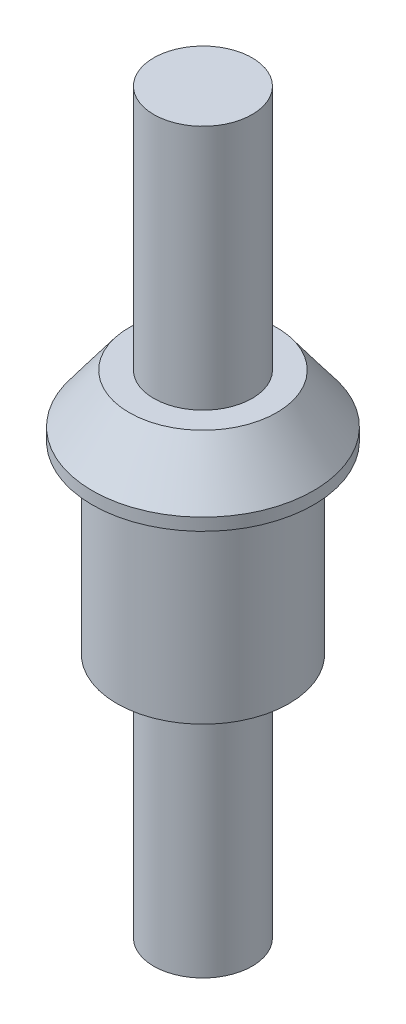
ISO-10303-21;
HEADER;
FILE_DESCRIPTION(('STEP AP214'),'2;1');
FILE_NAME('part.step','',(''),(''),'','','');
FILE_SCHEMA(('AUTOMOTIVE_DESIGN { 1 0 10303 214 1 1 1 1 }'));
ENDSEC;
DATA;
#1=APPLICATION_CONTEXT('core data for automotive mechanical design processes');
#2=APPLICATION_PROTOCOL_DEFINITION('international standard','automotive_design',2000,#1);
#3=PRODUCT_CONTEXT('',#1,'mechanical');
#4=PRODUCT('Part','Part','',(#3));
#5=PRODUCT_RELATED_PRODUCT_CATEGORY('part','',(#4));
#6=PRODUCT_DEFINITION_FORMATION('','',#4);
#7=PRODUCT_DEFINITION_CONTEXT('part definition',#1,'design');
#8=PRODUCT_DEFINITION('design','',#6,#7);
#9=PRODUCT_DEFINITION_SHAPE('','',#8);
#10=(LENGTH_UNIT() NAMED_UNIT(*) SI_UNIT(.MILLI.,.METRE.));
#11=(NAMED_UNIT(*) PLANE_ANGLE_UNIT() SI_UNIT($,.RADIAN.));
#12=(NAMED_UNIT(*) SI_UNIT($,.STERADIAN.) SOLID_ANGLE_UNIT());
#13=UNCERTAINTY_MEASURE_WITH_UNIT(LENGTH_MEASURE(1.E-05),#10,'distance_accuracy_value','');
#14=(GEOMETRIC_REPRESENTATION_CONTEXT(3) GLOBAL_UNCERTAINTY_ASSIGNED_CONTEXT((#13)) GLOBAL_UNIT_ASSIGNED_CONTEXT((#10,
#11,#12)) REPRESENTATION_CONTEXT('',''));
#15=CARTESIAN_POINT('',(0.,0.,0.));
#16=DIRECTION('',(0.,0.,1.));
#17=DIRECTION('',(1.,0.,0.));
#18=AXIS2_PLACEMENT_3D('',#15,#16,#17);
#19=CARTESIAN_POINT('',(0.,-9.44996568995171,0.));
#20=DIRECTION('',(0.,-1.,0.));
#21=DIRECTION('',(0.,0.,-1.));
#22=AXIS2_PLACEMENT_3D('',#19,#20,#21);
#23=PLANE('',#22);
#24=CARTESIAN_POINT('',(0.,-9.44996568995171,0.));
#25=DIRECTION('',(0.,1.,0.));
#26=DIRECTION('',(0.,0.,1.));
#27=AXIS2_PLACEMENT_3D('',#24,#25,#26);
#28=CIRCLE('',#27,0.400000000000005);
#29=CARTESIAN_POINT('',(0.,-9.44996568995171,0.400000000000005));
#30=VERTEX_POINT('',#29);
#31=EDGE_CURVE('E10',#30,#30,#28,.T.);
#32=ORIENTED_EDGE('',*,*,#31,.T.);
#33=EDGE_LOOP('',(#32));
#34=FACE_BOUND('',#33,.T.);
#35=ADVANCED_FACE('F30',(#34),#23,.F.);
#36=CARTESIAN_POINT('',(0.,28.0280897143989,0.));
#37=DIRECTION('',(0.,1.,0.));
#38=DIRECTION('',(0.,0.,1.));
#39=AXIS2_PLACEMENT_3D('',#36,#37,#38);
#40=CYLINDRICAL_SURFACE('',#39,0.400000000000005);
#41=ORIENTED_EDGE('',*,*,#31,.F.);
#42=EDGE_LOOP('',(#41));
#43=FACE_BOUND('',#42,.T.);
#44=CARTESIAN_POINT('',(0.,-11.4499656899517,0.));
#45=DIRECTION('',(0.,1.,0.));
#46=DIRECTION('',(0.,0.,1.));
#47=AXIS2_PLACEMENT_3D('',#44,#45,#46);
#48=CIRCLE('',#47,0.400000000000005);
#49=CARTESIAN_POINT('',(0.,-11.4499656899517,0.400000000000005));
#50=VERTEX_POINT('',#49);
#51=EDGE_CURVE('E36',#50,#50,#48,.T.);
#52=ORIENTED_EDGE('',*,*,#51,.T.);
#53=EDGE_LOOP('',(#52));
#54=FACE_BOUND('',#53,.T.);
#55=ADVANCED_FACE('F77',(#43,#54),#40,.T.);
#56=CARTESIAN_POINT('',(0.400000000000005,-11.4499656899517,0.));
#57=DIRECTION('',(0.,-1.,0.));
#58=DIRECTION('',(0.,0.,-1.));
#59=AXIS2_PLACEMENT_3D('',#56,#57,#58);
#60=PLANE('',#59);
#61=ORIENTED_EDGE('',*,*,#51,.F.);
#62=EDGE_LOOP('',(#61));
#63=FACE_BOUND('',#62,.T.);
#64=CARTESIAN_POINT('',(0.,-11.4499656899517,0.));
#65=DIRECTION('',(0.,1.,0.));
#66=DIRECTION('',(0.,0.,1.));
#67=AXIS2_PLACEMENT_3D('',#64,#65,#66);
#68=CIRCLE('',#67,0.600000000000005);
#69=CARTESIAN_POINT('',(0.,-11.4499656899517,0.600000000000005));
#70=VERTEX_POINT('',#69);
#71=EDGE_CURVE('E40',#70,#70,#68,.T.);
#72=ORIENTED_EDGE('',*,*,#71,.T.);
#73=EDGE_LOOP('',(#72));
#74=FACE_BOUND('',#73,.T.);
#75=ADVANCED_FACE('F81',(#63,#74),#60,.F.);
#76=CARTESIAN_POINT('',(0.,-11.8499903389932,0.));
#77=DIRECTION('',(0.,-1.,0.));
#78=DIRECTION('',(0.,0.,-1.));
#79=AXIS2_PLACEMENT_3D('',#76,#77,#78);
#80=CONICAL_SURFACE('',#79,0.900000000000005,0.643471531110042);
#81=ORIENTED_EDGE('',*,*,#71,.F.);
#82=EDGE_LOOP('',(#81));
#83=FACE_BOUND('',#82,.T.);
#84=CARTESIAN_POINT('',(0.,-11.8499903389932,0.));
#85=DIRECTION('',(0.,1.,0.));
#86=DIRECTION('',(0.,0.,1.));
#87=AXIS2_PLACEMENT_3D('',#84,#85,#86);
#88=CIRCLE('',#87,0.900000000000005);
#89=CARTESIAN_POINT('',(0.,-11.8499903389932,0.900000000000005));
#90=VERTEX_POINT('',#89);
#91=EDGE_CURVE('E44',#90,#90,#88,.T.);
#92=ORIENTED_EDGE('',*,*,#91,.T.);
#93=EDGE_LOOP('',(#92));
#94=FACE_BOUND('',#93,.T.);
#95=ADVANCED_FACE('F86',(#83,#94),#80,.T.);
#96=CARTESIAN_POINT('',(0.,28.0280897143989,0.));
#97=DIRECTION('',(0.,1.,0.));
#98=DIRECTION('',(0.,0.,1.));
#99=AXIS2_PLACEMENT_3D('',#96,#97,#98);
#100=CYLINDRICAL_SURFACE('',#99,0.900000000000005);
#101=ORIENTED_EDGE('',*,*,#91,.F.);
#102=EDGE_LOOP('',(#101));
#103=FACE_BOUND('',#102,.T.);
#104=CARTESIAN_POINT('',(0.,-11.9499903389932,0.));
#105=DIRECTION('',(0.,1.,0.));
#106=DIRECTION('',(0.,0.,1.));
#107=AXIS2_PLACEMENT_3D('',#104,#105,#106);
#108=CIRCLE('',#107,0.900000000000005);
#109=CARTESIAN_POINT('',(0.,-11.9499903389932,0.900000000000005));
#110=VERTEX_POINT('',#109);
#111=EDGE_CURVE('E49',#110,#110,#108,.T.);
#112=ORIENTED_EDGE('',*,*,#111,.T.);
#113=EDGE_LOOP('',(#112));
#114=FACE_BOUND('',#113,.T.);
#115=ADVANCED_FACE('F92',(#103,#114),#100,.T.);
#116=CARTESIAN_POINT('',(0.900000000000005,-11.9499903389932,0.));
#117=DIRECTION('',(0.,1.,0.));
#118=DIRECTION('',(0.,0.,1.));
#119=AXIS2_PLACEMENT_3D('',#116,#117,#118);
#120=PLANE('',#119);
#121=ORIENTED_EDGE('',*,*,#111,.F.);
#122=EDGE_LOOP('',(#121));
#123=FACE_BOUND('',#122,.T.);
#124=CARTESIAN_POINT('',(0.,-11.9499903389932,0.));
#125=DIRECTION('',(0.,1.,0.));
#126=DIRECTION('',(0.,0.,1.));
#127=AXIS2_PLACEMENT_3D('',#124,#125,#126);
#128=CIRCLE('',#127,0.700000000000005);
#129=CARTESIAN_POINT('',(0.,-11.9499903389932,0.700000000000005));
#130=VERTEX_POINT('',#129);
#131=EDGE_CURVE('E52',#130,#130,#128,.T.);
#132=ORIENTED_EDGE('',*,*,#131,.T.);
#133=EDGE_LOOP('',(#132));
#134=FACE_BOUND('',#133,.T.);
#135=ADVANCED_FACE('F96',(#123,#134),#120,.F.);
#136=CARTESIAN_POINT('',(0.,28.0280897143989,0.));
#137=DIRECTION('',(0.,1.,0.));
#138=DIRECTION('',(0.,0.,1.));
#139=AXIS2_PLACEMENT_3D('',#136,#137,#138);
#140=CYLINDRICAL_SURFACE('',#139,0.700000000000005);
#141=ORIENTED_EDGE('',*,*,#131,.F.);
#142=EDGE_LOOP('',(#141));
#143=FACE_BOUND('',#142,.T.);
#144=CARTESIAN_POINT('',(0.,-13.4499656899517,0.));
#145=DIRECTION('',(0.,1.,0.));
#146=DIRECTION('',(0.,0.,1.));
#147=AXIS2_PLACEMENT_3D('',#144,#145,#146);
#148=CIRCLE('',#147,0.700000000000005);
#149=CARTESIAN_POINT('',(0.,-13.4499656899517,0.700000000000005));
#150=VERTEX_POINT('',#149);
#151=EDGE_CURVE('E55',#150,#150,#148,.T.);
#152=ORIENTED_EDGE('',*,*,#151,.T.);
#153=EDGE_LOOP('',(#152));
#154=FACE_BOUND('',#153,.T.);
#155=ADVANCED_FACE('F100',(#143,#154),#140,.T.);
#156=CARTESIAN_POINT('',(0.700000000000005,-13.4499656899517,0.));
#157=DIRECTION('',(0.,1.,0.));
#158=DIRECTION('',(0.,0.,1.));
#159=AXIS2_PLACEMENT_3D('',#156,#157,#158);
#160=PLANE('',#159);
#161=ORIENTED_EDGE('',*,*,#151,.F.);
#162=EDGE_LOOP('',(#161));
#163=FACE_BOUND('',#162,.T.);
#164=CARTESIAN_POINT('',(0.,-13.4499656899517,0.));
#165=DIRECTION('',(0.,1.,0.));
#166=DIRECTION('',(0.,0.,1.));
#167=AXIS2_PLACEMENT_3D('',#164,#165,#166);
#168=CIRCLE('',#167,0.400000000000005);
#169=CARTESIAN_POINT('',(0.,-13.4499656899517,0.400000000000005));
#170=VERTEX_POINT('',#169);
#171=EDGE_CURVE('E58',#170,#170,#168,.T.);
#172=ORIENTED_EDGE('',*,*,#171,.T.);
#173=EDGE_LOOP('',(#172));
#174=FACE_BOUND('',#173,.T.);
#175=ADVANCED_FACE('F73',(#163,#174),#160,.F.);
#176=CARTESIAN_POINT('',(0.,28.0280897143989,0.));
#177=DIRECTION('',(0.,1.,0.));
#178=DIRECTION('',(0.,0.,1.));
#179=AXIS2_PLACEMENT_3D('',#176,#177,#178);
#180=CYLINDRICAL_SURFACE('',#179,0.400000000000005);
#181=ORIENTED_EDGE('',*,*,#171,.F.);
#182=EDGE_LOOP('',(#181));
#183=FACE_BOUND('',#182,.T.);
#184=CARTESIAN_POINT('',(0.,-15.4499656899517,0.));
#185=DIRECTION('',(0.,1.,0.));
#186=DIRECTION('',(0.,0.,1.));
#187=AXIS2_PLACEMENT_3D('',#184,#185,#186);
#188=CIRCLE('',#187,0.400000000000005);
#189=CARTESIAN_POINT('',(0.,-15.4499656899517,0.400000000000005));
#190=VERTEX_POINT('',#189);
#191=EDGE_CURVE('E61',#190,#190,#188,.T.);
#192=ORIENTED_EDGE('',*,*,#191,.T.);
#193=EDGE_LOOP('',(#192));
#194=FACE_BOUND('',#193,.T.);
#195=ADVANCED_FACE('F65',(#183,#194),#180,.T.);
#196=CARTESIAN_POINT('',(0.400000000000005,-15.4499656899517,0.));
#197=DIRECTION('',(0.,1.,0.));
#198=DIRECTION('',(0.,0.,1.));
#199=AXIS2_PLACEMENT_3D('',#196,#197,#198);
#200=PLANE('',#199);
#201=ORIENTED_EDGE('',*,*,#191,.F.);
#202=EDGE_LOOP('',(#201));
#203=FACE_BOUND('',#202,.T.);
#204=ADVANCED_FACE('F67',(#203),#200,.F.);
#205=CLOSED_SHELL('',(#35,#55,#75,#95,#115,#135,#155,#175,#195,#204));
#206=MANIFOLD_SOLID_BREP('B2',#205);
#207=ADVANCED_BREP_SHAPE_REPRESENTATION('',(#18,#206),#14);
#208=SHAPE_DEFINITION_REPRESENTATION(#9,#207);
ENDSEC;
END-ISO-10303-21;
